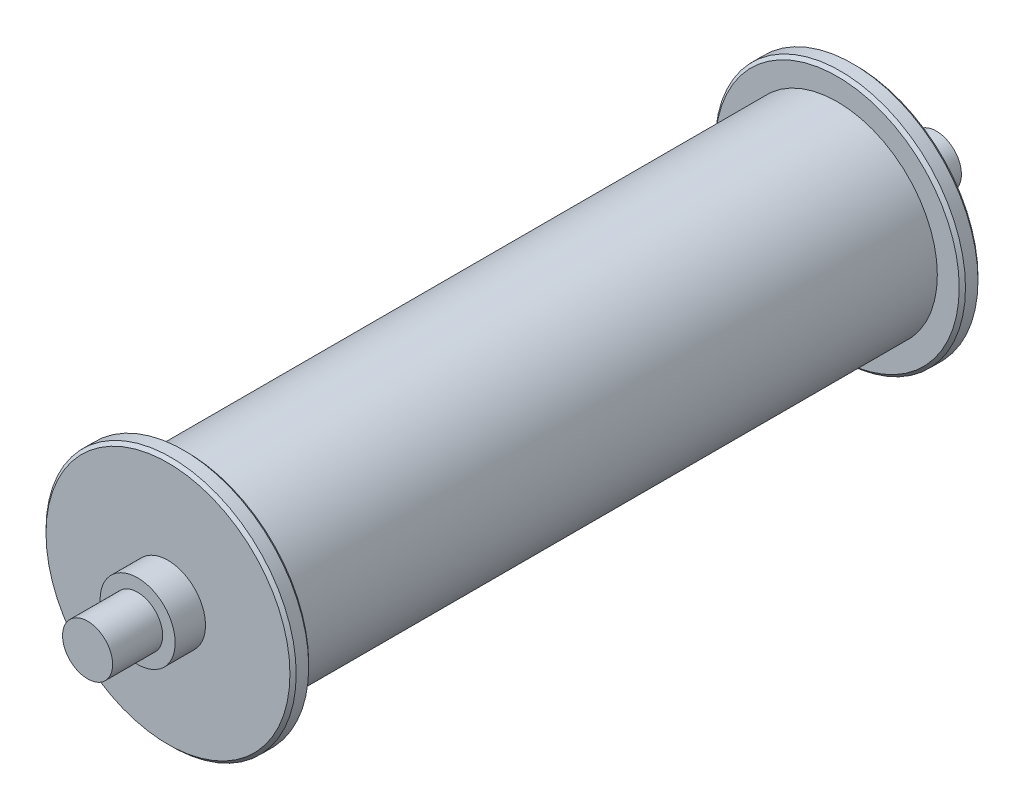
ISO-10303-21;
HEADER;
FILE_DESCRIPTION(('STEP AP214'),'2;1');
FILE_NAME('part.step','',(''),(''),'','','');
FILE_SCHEMA(('AUTOMOTIVE_DESIGN { 1 0 10303 214 1 1 1 1 }'));
ENDSEC;
DATA;
#1=APPLICATION_CONTEXT('core data for automotive mechanical design processes');
#2=APPLICATION_PROTOCOL_DEFINITION('international standard','automotive_design',2000,#1);
#3=PRODUCT_CONTEXT('',#1,'mechanical');
#4=PRODUCT('Part','Part','',(#3));
#5=PRODUCT_RELATED_PRODUCT_CATEGORY('part','',(#4));
#6=PRODUCT_DEFINITION_FORMATION('','',#4);
#7=PRODUCT_DEFINITION_CONTEXT('part definition',#1,'design');
#8=PRODUCT_DEFINITION('design','',#6,#7);
#9=PRODUCT_DEFINITION_SHAPE('','',#8);
#10=(LENGTH_UNIT() NAMED_UNIT(*) SI_UNIT(.MILLI.,.METRE.));
#11=(NAMED_UNIT(*) PLANE_ANGLE_UNIT() SI_UNIT($,.RADIAN.));
#12=(NAMED_UNIT(*) SI_UNIT($,.STERADIAN.) SOLID_ANGLE_UNIT());
#13=UNCERTAINTY_MEASURE_WITH_UNIT(LENGTH_MEASURE(1.E-05),#10,'distance_accuracy_value','');
#14=(GEOMETRIC_REPRESENTATION_CONTEXT(3) GLOBAL_UNCERTAINTY_ASSIGNED_CONTEXT((#13)) GLOBAL_UNIT_ASSIGNED_CONTEXT((#10,
#11,#12)) REPRESENTATION_CONTEXT('',''));
#15=CARTESIAN_POINT('',(0.,0.,0.));
#16=DIRECTION('',(0.,0.,1.));
#17=DIRECTION('',(1.,0.,0.));
#18=AXIS2_PLACEMENT_3D('',#15,#16,#17);
#19=CARTESIAN_POINT('',(0.,0.,3.));
#20=DIRECTION('',(0.,0.,-1.));
#21=DIRECTION('',(-1.,0.,0.));
#22=AXIS2_PLACEMENT_3D('',#19,#20,#21);
#23=CYLINDRICAL_SURFACE('',#22,20.);
#24=CARTESIAN_POINT('',(0.,0.,0.499999999999997));
#25=DIRECTION('',(0.,0.,1.));
#26=DIRECTION('',(1.,0.,0.));
#27=AXIS2_PLACEMENT_3D('',#24,#25,#26);
#28=CIRCLE('',#27,20.);
#29=CARTESIAN_POINT('',(20.,0.,0.499999999999997));
#30=VERTEX_POINT('',#29);
#31=EDGE_CURVE('E77',#30,#30,#28,.T.);
#32=ORIENTED_EDGE('',*,*,#31,.T.);
#33=EDGE_LOOP('',(#32));
#34=FACE_BOUND('',#33,.T.);
#35=CARTESIAN_POINT('',(0.,0.,2.49999999999999));
#36=DIRECTION('',(0.,0.,1.));
#37=DIRECTION('',(1.,0.,0.));
#38=AXIS2_PLACEMENT_3D('',#35,#36,#37);
#39=CIRCLE('',#38,20.);
#40=CARTESIAN_POINT('',(20.,0.,2.49999999999999));
#41=VERTEX_POINT('',#40);
#42=EDGE_CURVE('E69',#41,#41,#39,.F.);
#43=ORIENTED_EDGE('',*,*,#42,.T.);
#44=EDGE_LOOP('',(#43));
#45=FACE_BOUND('',#44,.T.);
#46=ADVANCED_FACE('F44',(#34,#45),#23,.T.);
#47=CARTESIAN_POINT('',(0.,0.,3.));
#48=DIRECTION('',(0.,0.,1.));
#49=DIRECTION('',(1.,0.,0.));
#50=AXIS2_PLACEMENT_3D('',#47,#48,#49);
#51=PLANE('',#50);
#52=CARTESIAN_POINT('',(0.,0.,3.));
#53=DIRECTION('',(0.,0.,1.));
#54=DIRECTION('',(1.,0.,0.));
#55=AXIS2_PLACEMENT_3D('',#52,#53,#54);
#56=CIRCLE('',#55,16.);
#57=CARTESIAN_POINT('',(-16.,0.,3.));
#58=VERTEX_POINT('',#57);
#59=EDGE_CURVE('E70',#58,#58,#56,.T.);
#60=ORIENTED_EDGE('',*,*,#59,.F.);
#61=EDGE_LOOP('',(#60));
#62=FACE_BOUND('',#61,.T.);
#63=CARTESIAN_POINT('',(0.,0.,3.));
#64=DIRECTION('',(0.,0.,1.));
#65=DIRECTION('',(1.,0.,0.));
#66=AXIS2_PLACEMENT_3D('',#63,#64,#65);
#67=CIRCLE('',#66,19.5);
#68=CARTESIAN_POINT('',(19.5,0.,3.));
#69=VERTEX_POINT('',#68);
#70=EDGE_CURVE('E74',#69,#69,#67,.T.);
#71=ORIENTED_EDGE('',*,*,#70,.T.);
#72=EDGE_LOOP('',(#71));
#73=FACE_BOUND('',#72,.T.);
#74=ADVANCED_FACE('F121',(#62,#73),#51,.T.);
#75=CARTESIAN_POINT('',(0.,0.,0.));
#76=DIRECTION('',(0.,0.,1.));
#77=DIRECTION('',(1.,0.,0.));
#78=AXIS2_PLACEMENT_3D('',#75,#76,#77);
#79=PLANE('',#78);
#80=CARTESIAN_POINT('',(0.,0.,0.));
#81=DIRECTION('',(0.,0.,-1.));
#82=DIRECTION('',(-1.,0.,0.));
#83=AXIS2_PLACEMENT_3D('',#80,#81,#82);
#84=CIRCLE('',#83,6.);
#85=CARTESIAN_POINT('',(-6.,0.,0.));
#86=VERTEX_POINT('',#85);
#87=EDGE_CURVE('E53',#86,#86,#84,.T.);
#88=ORIENTED_EDGE('',*,*,#87,.F.);
#89=EDGE_LOOP('',(#88));
#90=FACE_BOUND('',#89,.T.);
#91=CARTESIAN_POINT('',(0.,0.,0.));
#92=DIRECTION('',(0.,0.,1.));
#93=DIRECTION('',(1.,0.,0.));
#94=AXIS2_PLACEMENT_3D('',#91,#92,#93);
#95=CIRCLE('',#94,19.5);
#96=CARTESIAN_POINT('',(19.5,0.,0.));
#97=VERTEX_POINT('',#96);
#98=EDGE_CURVE('E80',#97,#97,#95,.F.);
#99=ORIENTED_EDGE('',*,*,#98,.T.);
#100=EDGE_LOOP('',(#99));
#101=FACE_BOUND('',#100,.T.);
#102=ADVANCED_FACE('F127',(#90,#101),#79,.F.);
#103=CARTESIAN_POINT('',(0.,0.,0.499999999999997));
#104=DIRECTION('',(0.,0.,1.));
#105=DIRECTION('',(1.,0.,0.));
#106=AXIS2_PLACEMENT_3D('',#103,#104,#105);
#107=CONICAL_SURFACE('',#106,20.,0.785398163397452);
#108=ORIENTED_EDGE('',*,*,#98,.F.);
#109=EDGE_LOOP('',(#108));
#110=FACE_BOUND('',#109,.T.);
#111=ORIENTED_EDGE('',*,*,#31,.F.);
#112=EDGE_LOOP('',(#111));
#113=FACE_BOUND('',#112,.T.);
#114=ADVANCED_FACE('F134',(#110,#113),#107,.T.);
#115=CARTESIAN_POINT('',(0.,0.,3.));
#116=DIRECTION('',(0.,0.,-1.));
#117=DIRECTION('',(-1.,0.,0.));
#118=AXIS2_PLACEMENT_3D('',#115,#116,#117);
#119=CONICAL_SURFACE('',#118,19.5,0.785398163397441);
#120=ORIENTED_EDGE('',*,*,#42,.F.);
#121=EDGE_LOOP('',(#120));
#122=FACE_BOUND('',#121,.T.);
#123=ORIENTED_EDGE('',*,*,#70,.F.);
#124=EDGE_LOOP('',(#123));
#125=FACE_BOUND('',#124,.T.);
#126=ADVANCED_FACE('F116',(#122,#125),#119,.T.);
#127=CARTESIAN_POINT('',(0.,0.,107.));
#128=DIRECTION('',(0.,0.,-1.));
#129=DIRECTION('',(-1.,0.,0.));
#130=AXIS2_PLACEMENT_3D('',#127,#128,#129);
#131=CYLINDRICAL_SURFACE('',#130,16.);
#132=CARTESIAN_POINT('',(0.,0.,107.));
#133=DIRECTION('',(0.,0.,1.));
#134=DIRECTION('',(1.,0.,0.));
#135=AXIS2_PLACEMENT_3D('',#132,#133,#134);
#136=CIRCLE('',#135,16.);
#137=CARTESIAN_POINT('',(-16.,0.,107.));
#138=VERTEX_POINT('',#137);
#139=EDGE_CURVE('E65',#138,#138,#136,.T.);
#140=CARTESIAN_POINT('',(-16.,0.,107.));
#141=CARTESIAN_POINT('',(-16.,0.,105.916666666667));
#142=CARTESIAN_POINT('',(-16.,0.,104.833333333333));
#143=CARTESIAN_POINT('',(-16.,0.,102.666666666667));
#144=CARTESIAN_POINT('',(-16.,0.,101.583333333333));
#145=CARTESIAN_POINT('',(-16.,0.,99.4166666666667));
#146=CARTESIAN_POINT('',(-16.,0.,98.3333333333333));
#147=CARTESIAN_POINT('',(-16.,0.,96.1666666666667));
#148=CARTESIAN_POINT('',(-16.,0.,95.0833333333333));
#149=CARTESIAN_POINT('',(-16.,0.,92.9166666666667));
#150=CARTESIAN_POINT('',(-16.,0.,91.8333333333333));
#151=CARTESIAN_POINT('',(-16.,0.,89.6666666666667));
#152=CARTESIAN_POINT('',(-16.,0.,88.5833333333333));
#153=CARTESIAN_POINT('',(-16.,0.,86.4166666666667));
#154=CARTESIAN_POINT('',(-16.,0.,85.3333333333333));
#155=CARTESIAN_POINT('',(-16.,0.,83.1666666666667));
#156=CARTESIAN_POINT('',(-16.,0.,82.0833333333333));
#157=CARTESIAN_POINT('',(-16.,0.,79.9166666666666));
#158=CARTESIAN_POINT('',(-16.,0.,78.8333333333333));
#159=CARTESIAN_POINT('',(-16.,0.,76.6666666666667));
#160=CARTESIAN_POINT('',(-16.,0.,75.5833333333333));
#161=CARTESIAN_POINT('',(-16.,0.,73.4166666666667));
#162=CARTESIAN_POINT('',(-16.,0.,72.3333333333333));
#163=CARTESIAN_POINT('',(-16.,0.,70.1666666666667));
#164=CARTESIAN_POINT('',(-16.,0.,69.0833333333333));
#165=CARTESIAN_POINT('',(-16.,0.,66.9166666666667));
#166=CARTESIAN_POINT('',(-16.,0.,65.8333333333333));
#167=CARTESIAN_POINT('',(-16.,0.,63.6666666666667));
#168=CARTESIAN_POINT('',(-16.,0.,62.5833333333333));
#169=CARTESIAN_POINT('',(-16.,0.,60.4166666666667));
#170=CARTESIAN_POINT('',(-16.,0.,59.3333333333333));
#171=CARTESIAN_POINT('',(-16.,0.,57.1666666666667));
#172=CARTESIAN_POINT('',(-16.,0.,56.0833333333333));
#173=CARTESIAN_POINT('',(-16.,0.,53.9166666666667));
#174=CARTESIAN_POINT('',(-16.,0.,52.8333333333333));
#175=CARTESIAN_POINT('',(-16.,0.,50.6666666666667));
#176=CARTESIAN_POINT('',(-16.,0.,49.5833333333333));
#177=CARTESIAN_POINT('',(-16.,0.,47.4166666666667));
#178=CARTESIAN_POINT('',(-16.,0.,46.3333333333333));
#179=CARTESIAN_POINT('',(-16.,0.,44.1666666666667));
#180=CARTESIAN_POINT('',(-16.,0.,43.0833333333333));
#181=CARTESIAN_POINT('',(-16.,0.,40.9166666666667));
#182=CARTESIAN_POINT('',(-16.,0.,39.8333333333333));
#183=CARTESIAN_POINT('',(-16.,0.,37.6666666666667));
#184=CARTESIAN_POINT('',(-16.,0.,36.5833333333333));
#185=CARTESIAN_POINT('',(-16.,0.,34.4166666666667));
#186=CARTESIAN_POINT('',(-16.,0.,33.3333333333333));
#187=CARTESIAN_POINT('',(-16.,0.,31.1666666666667));
#188=CARTESIAN_POINT('',(-16.,0.,30.0833333333333));
#189=CARTESIAN_POINT('',(-16.,0.,27.9166666666667));
#190=CARTESIAN_POINT('',(-16.,0.,26.8333333333333));
#191=CARTESIAN_POINT('',(-16.,0.,24.6666666666667));
#192=CARTESIAN_POINT('',(-16.,0.,23.5833333333333));
#193=CARTESIAN_POINT('',(-16.,0.,21.4166666666667));
#194=CARTESIAN_POINT('',(-16.,0.,20.3333333333333));
#195=CARTESIAN_POINT('',(-16.,0.,18.1666666666667));
#196=CARTESIAN_POINT('',(-16.,0.,17.0833333333333));
#197=CARTESIAN_POINT('',(-16.,0.,14.9166666666667));
#198=CARTESIAN_POINT('',(-16.,0.,13.8333333333333));
#199=CARTESIAN_POINT('',(-16.,0.,11.6666666666667));
#200=CARTESIAN_POINT('',(-16.,0.,10.5833333333333));
#201=CARTESIAN_POINT('',(-16.,0.,8.41666666666667));
#202=CARTESIAN_POINT('',(-16.,0.,7.33333333333334));
#203=CARTESIAN_POINT('',(-16.,0.,5.16666666666667));
#204=CARTESIAN_POINT('',(-16.,0.,4.08333333333334));
#205=CARTESIAN_POINT('',(-16.,0.,3.));
#206=B_SPLINE_CURVE_WITH_KNOTS('',3,(#140,#141,#142,#143,#144,#145,#146,#147,#148,#149,#150,
#151,#152,#153,#154,#155,#156,#157,#158,#159,#160,#161,#162,#163,#164,#165,#166,#167,#168,#169,
#170,#171,#172,#173,#174,#175,#176,#177,#178,#179,#180,#181,#182,#183,#184,#185,#186,#187,#188,
#189,#190,#191,#192,#193,#194,#195,#196,#197,#198,#199,#200,#201,#202,#203,#204,#205),
.UNSPECIFIED.,.F.,.F.,(4,2,2,2,2,2,2,2,2,2,2,2,2,2,2,2,2,2,2,2,2,2,2,2,2,2,2,2,2,2,2,2,4),(0.,
3.25,6.50000000000001,9.75000000000001,13.,16.25,19.5,22.75,26.,29.25,32.5,35.75,39.,42.25,45.5,
48.75,52.,55.25,58.5,61.75,65.,68.25,71.5,74.75,78.,81.25,84.5,87.75,91.,94.25,97.5,100.75,
104.),.UNSPECIFIED.);
#207=EDGE_CURVE('BSEAM108',#138,#58,#206,.T.);
#208=ORIENTED_EDGE('',*,*,#139,.F.);
#209=ORIENTED_EDGE('',*,*,#59,.T.);
#210=ORIENTED_EDGE('',*,*,#207,.T.);
#211=ORIENTED_EDGE('',*,*,#207,.F.);
#212=EDGE_LOOP('',(#208,#210,#209,#211));
#213=FACE_BOUND('',#212,.T.);
#214=ADVANCED_FACE('F108',(#213),#131,.T.);
#215=CARTESIAN_POINT('',(0.,0.,110.));
#216=DIRECTION('',(0.,0.,-1.));
#217=DIRECTION('',(-1.,0.,0.));
#218=AXIS2_PLACEMENT_3D('',#215,#216,#217);
#219=CYLINDRICAL_SURFACE('',#218,20.);
#220=CARTESIAN_POINT('',(0.,0.,109.5));
#221=DIRECTION('',(0.,0.,1.));
#222=DIRECTION('',(1.,0.,0.));
#223=AXIS2_PLACEMENT_3D('',#220,#221,#222);
#224=CIRCLE('',#223,20.);
#225=CARTESIAN_POINT('',(20.,0.,109.5));
#226=VERTEX_POINT('',#225);
#227=EDGE_CURVE('E89',#226,#226,#224,.F.);
#228=ORIENTED_EDGE('',*,*,#227,.T.);
#229=EDGE_LOOP('',(#228));
#230=FACE_BOUND('',#229,.T.);
#231=CARTESIAN_POINT('',(0.,0.,107.5));
#232=DIRECTION('',(0.,0.,1.));
#233=DIRECTION('',(1.,0.,0.));
#234=AXIS2_PLACEMENT_3D('',#231,#232,#233);
#235=CIRCLE('',#234,20.);
#236=CARTESIAN_POINT('',(20.,0.,107.5));
#237=VERTEX_POINT('',#236);
#238=EDGE_CURVE('E87',#237,#237,#235,.T.);
#239=ORIENTED_EDGE('',*,*,#238,.T.);
#240=EDGE_LOOP('',(#239));
#241=FACE_BOUND('',#240,.T.);
#242=ADVANCED_FACE('F105',(#230,#241),#219,.T.);
#243=CARTESIAN_POINT('',(0.,0.,110.));
#244=DIRECTION('',(0.,0.,1.));
#245=DIRECTION('',(1.,0.,0.));
#246=AXIS2_PLACEMENT_3D('',#243,#244,#245);
#247=PLANE('',#246);
#248=CARTESIAN_POINT('',(0.,0.,110.));
#249=DIRECTION('',(0.,0.,-1.));
#250=DIRECTION('',(-1.,0.,0.));
#251=AXIS2_PLACEMENT_3D('',#248,#249,#250);
#252=CIRCLE('',#251,6.);
#253=CARTESIAN_POINT('',(-6.,0.,110.));
#254=VERTEX_POINT('',#253);
#255=EDGE_CURVE('E194',#254,#254,#252,.T.);
#256=ORIENTED_EDGE('',*,*,#255,.T.);
#257=EDGE_LOOP('',(#256));
#258=FACE_BOUND('',#257,.T.);
#259=CARTESIAN_POINT('',(0.,0.,110.));
#260=DIRECTION('',(0.,0.,1.));
#261=DIRECTION('',(1.,0.,0.));
#262=AXIS2_PLACEMENT_3D('',#259,#260,#261);
#263=CIRCLE('',#262,19.5);
#264=CARTESIAN_POINT('',(19.5,0.,110.));
#265=VERTEX_POINT('',#264);
#266=EDGE_CURVE('E73',#265,#265,#263,.T.);
#267=ORIENTED_EDGE('',*,*,#266,.T.);
#268=EDGE_LOOP('',(#267));
#269=FACE_BOUND('',#268,.T.);
#270=ADVANCED_FACE('F107',(#258,#269),#247,.T.);
#271=CARTESIAN_POINT('',(0.,0.,107.));
#272=DIRECTION('',(0.,0.,1.));
#273=DIRECTION('',(1.,0.,0.));
#274=AXIS2_PLACEMENT_3D('',#271,#272,#273);
#275=PLANE('',#274);
#276=CARTESIAN_POINT('',(0.,0.,107.));
#277=DIRECTION('',(0.,0.,1.));
#278=DIRECTION('',(1.,0.,0.));
#279=AXIS2_PLACEMENT_3D('',#276,#277,#278);
#280=CIRCLE('',#279,19.5);
#281=CARTESIAN_POINT('',(19.5,0.,107.));
#282=VERTEX_POINT('',#281);
#283=EDGE_CURVE('E49',#282,#282,#280,.F.);
#284=ORIENTED_EDGE('',*,*,#283,.T.);
#285=EDGE_LOOP('',(#284));
#286=FACE_BOUND('',#285,.T.);
#287=ORIENTED_EDGE('',*,*,#139,.T.);
#288=EDGE_LOOP('',(#287));
#289=FACE_BOUND('',#288,.T.);
#290=ADVANCED_FACE('F96',(#286,#289),#275,.F.);
#291=CARTESIAN_POINT('',(0.,0.,110.));
#292=DIRECTION('',(0.,0.,-1.));
#293=DIRECTION('',(-1.,0.,0.));
#294=AXIS2_PLACEMENT_3D('',#291,#292,#293);
#295=CONICAL_SURFACE('',#294,19.5,0.785398163397441);
#296=ORIENTED_EDGE('',*,*,#227,.F.);
#297=EDGE_LOOP('',(#296));
#298=FACE_BOUND('',#297,.T.);
#299=ORIENTED_EDGE('',*,*,#266,.F.);
#300=EDGE_LOOP('',(#299));
#301=FACE_BOUND('',#300,.T.);
#302=ADVANCED_FACE('F102',(#298,#301),#295,.T.);
#303=CARTESIAN_POINT('',(0.,0.,107.5));
#304=DIRECTION('',(0.,0.,1.));
#305=DIRECTION('',(1.,0.,0.));
#306=AXIS2_PLACEMENT_3D('',#303,#304,#305);
#307=CONICAL_SURFACE('',#306,20.,0.785398163397441);
#308=ORIENTED_EDGE('',*,*,#283,.F.);
#309=EDGE_LOOP('',(#308));
#310=FACE_BOUND('',#309,.T.);
#311=ORIENTED_EDGE('',*,*,#238,.F.);
#312=EDGE_LOOP('',(#311));
#313=FACE_BOUND('',#312,.T.);
#314=ADVANCED_FACE('F47',(#310,#313),#307,.T.);
#315=CARTESIAN_POINT('',(0.,0.,-4.85));
#316=DIRECTION('',(0.,0.,1.));
#317=DIRECTION('',(1.,0.,0.));
#318=AXIS2_PLACEMENT_3D('',#315,#316,#317);
#319=CYLINDRICAL_SURFACE('',#318,6.);
#320=CARTESIAN_POINT('',(0.,0.,-4.85));
#321=DIRECTION('',(0.,0.,-1.));
#322=DIRECTION('',(-1.,0.,0.));
#323=AXIS2_PLACEMENT_3D('',#320,#321,#322);
#324=CIRCLE('',#323,6.);
#325=CARTESIAN_POINT('',(-6.,0.,-4.85));
#326=VERTEX_POINT('',#325);
#327=EDGE_CURVE('E63',#326,#326,#324,.T.);
#328=ORIENTED_EDGE('',*,*,#327,.F.);
#329=EDGE_LOOP('',(#328));
#330=FACE_BOUND('',#329,.T.);
#331=ORIENTED_EDGE('',*,*,#87,.T.);
#332=EDGE_LOOP('',(#331));
#333=FACE_BOUND('',#332,.T.);
#334=ADVANCED_FACE('F101',(#330,#333),#319,.T.);
#335=CARTESIAN_POINT('',(0.,0.,-4.85));
#336=DIRECTION('',(0.,0.,-1.));
#337=DIRECTION('',(-1.,0.,0.));
#338=AXIS2_PLACEMENT_3D('',#335,#336,#337);
#339=PLANE('',#338);
#340=CARTESIAN_POINT('',(0.,0.,-4.85));
#341=DIRECTION('',(0.,0.,-1.));
#342=DIRECTION('',(-1.,0.,0.));
#343=AXIS2_PLACEMENT_3D('',#340,#341,#342);
#344=CIRCLE('',#343,4.);
#345=CARTESIAN_POINT('',(-4.,0.,-4.85));
#346=VERTEX_POINT('',#345);
#347=EDGE_CURVE('E10',#346,#346,#344,.T.);
#348=ORIENTED_EDGE('',*,*,#347,.F.);
#349=EDGE_LOOP('',(#348));
#350=FACE_BOUND('',#349,.T.);
#351=ORIENTED_EDGE('',*,*,#327,.T.);
#352=EDGE_LOOP('',(#351));
#353=FACE_BOUND('',#352,.T.);
#354=ADVANCED_FACE('F161',(#350,#353),#339,.T.);
#355=CARTESIAN_POINT('',(0.,0.,-12.85));
#356=DIRECTION('',(0.,0.,1.));
#357=DIRECTION('',(1.,0.,0.));
#358=AXIS2_PLACEMENT_3D('',#355,#356,#357);
#359=CYLINDRICAL_SURFACE('',#358,4.);
#360=CARTESIAN_POINT('',(0.,0.,-12.85));
#361=DIRECTION('',(0.,0.,-1.));
#362=DIRECTION('',(-1.,0.,0.));
#363=AXIS2_PLACEMENT_3D('',#360,#361,#362);
#364=CIRCLE('',#363,4.);
#365=CARTESIAN_POINT('',(-4.,0.,-12.85));
#366=VERTEX_POINT('',#365);
#367=EDGE_CURVE('E61',#366,#366,#364,.T.);
#368=ORIENTED_EDGE('',*,*,#367,.F.);
#369=EDGE_LOOP('',(#368));
#370=FACE_BOUND('',#369,.T.);
#371=ORIENTED_EDGE('',*,*,#347,.T.);
#372=EDGE_LOOP('',(#371));
#373=FACE_BOUND('',#372,.T.);
#374=ADVANCED_FACE('F165',(#370,#373),#359,.T.);
#375=CARTESIAN_POINT('',(0.,0.,-12.85));
#376=DIRECTION('',(0.,0.,-1.));
#377=DIRECTION('',(-1.,0.,0.));
#378=AXIS2_PLACEMENT_3D('',#375,#376,#377);
#379=PLANE('',#378);
#380=ORIENTED_EDGE('',*,*,#367,.T.);
#381=EDGE_LOOP('',(#380));
#382=FACE_BOUND('',#381,.T.);
#383=ADVANCED_FACE('F169',(#382),#379,.T.);
#384=CARTESIAN_POINT('',(0.,0.,114.85));
#385=DIRECTION('',(0.,0.,-1.));
#386=DIRECTION('',(-1.,0.,0.));
#387=AXIS2_PLACEMENT_3D('',#384,#385,#386);
#388=CYLINDRICAL_SURFACE('',#387,6.);
#389=CARTESIAN_POINT('',(0.,0.,114.85));
#390=DIRECTION('',(0.,0.,-1.));
#391=DIRECTION('',(-1.,0.,0.));
#392=AXIS2_PLACEMENT_3D('',#389,#390,#391);
#393=CIRCLE('',#392,6.);
#394=CARTESIAN_POINT('',(-6.,0.,114.85));
#395=VERTEX_POINT('',#394);
#396=EDGE_CURVE('E198',#395,#395,#393,.T.);
#397=ORIENTED_EDGE('',*,*,#396,.T.);
#398=EDGE_LOOP('',(#397));
#399=FACE_BOUND('',#398,.T.);
#400=ORIENTED_EDGE('',*,*,#255,.F.);
#401=EDGE_LOOP('',(#400));
#402=FACE_BOUND('',#401,.T.);
#403=ADVANCED_FACE('F173',(#399,#402),#388,.T.);
#404=CARTESIAN_POINT('',(0.,0.,114.85));
#405=DIRECTION('',(0.,0.,1.));
#406=DIRECTION('',(-1.,0.,0.));
#407=AXIS2_PLACEMENT_3D('',#404,#405,#406);
#408=PLANE('',#407);
#409=CARTESIAN_POINT('',(0.,0.,114.85));
#410=DIRECTION('',(0.,0.,-1.));
#411=DIRECTION('',(-1.,0.,0.));
#412=AXIS2_PLACEMENT_3D('',#409,#410,#411);
#413=CIRCLE('',#412,4.);
#414=CARTESIAN_POINT('',(-4.,0.,114.85));
#415=VERTEX_POINT('',#414);
#416=EDGE_CURVE('E195',#415,#415,#413,.T.);
#417=ORIENTED_EDGE('',*,*,#416,.T.);
#418=EDGE_LOOP('',(#417));
#419=FACE_BOUND('',#418,.T.);
#420=ORIENTED_EDGE('',*,*,#396,.F.);
#421=EDGE_LOOP('',(#420));
#422=FACE_BOUND('',#421,.T.);
#423=ADVANCED_FACE('F177',(#419,#422),#408,.T.);
#424=CARTESIAN_POINT('',(0.,0.,122.85));
#425=DIRECTION('',(0.,0.,-1.));
#426=DIRECTION('',(-1.,0.,0.));
#427=AXIS2_PLACEMENT_3D('',#424,#425,#426);
#428=CYLINDRICAL_SURFACE('',#427,4.);
#429=CARTESIAN_POINT('',(0.,0.,122.85));
#430=DIRECTION('',(0.,0.,-1.));
#431=DIRECTION('',(-1.,0.,0.));
#432=AXIS2_PLACEMENT_3D('',#429,#430,#431);
#433=CIRCLE('',#432,4.);
#434=CARTESIAN_POINT('',(-4.,0.,122.85));
#435=VERTEX_POINT('',#434);
#436=EDGE_CURVE('E193',#435,#435,#433,.T.);
#437=ORIENTED_EDGE('',*,*,#436,.T.);
#438=EDGE_LOOP('',(#437));
#439=FACE_BOUND('',#438,.T.);
#440=ORIENTED_EDGE('',*,*,#416,.F.);
#441=EDGE_LOOP('',(#440));
#442=FACE_BOUND('',#441,.T.);
#443=ADVANCED_FACE('F181',(#439,#442),#428,.T.);
#444=CARTESIAN_POINT('',(0.,0.,122.85));
#445=DIRECTION('',(0.,0.,1.));
#446=DIRECTION('',(-1.,0.,0.));
#447=AXIS2_PLACEMENT_3D('',#444,#445,#446);
#448=PLANE('',#447);
#449=ORIENTED_EDGE('',*,*,#436,.F.);
#450=EDGE_LOOP('',(#449));
#451=FACE_BOUND('',#450,.T.);
#452=ADVANCED_FACE('F185',(#451),#448,.T.);
#453=CLOSED_SHELL('',(#46,#74,#102,#114,#126,#214,#242,#270,#290,#302,#314,#334,#354,#374,#383,
#403,#423,#443,#452));
#454=MANIFOLD_SOLID_BREP('B2',#453);
#455=ADVANCED_BREP_SHAPE_REPRESENTATION('',(#18,#454),#14);
#456=SHAPE_DEFINITION_REPRESENTATION(#9,#455);
ENDSEC;
END-ISO-10303-21;
